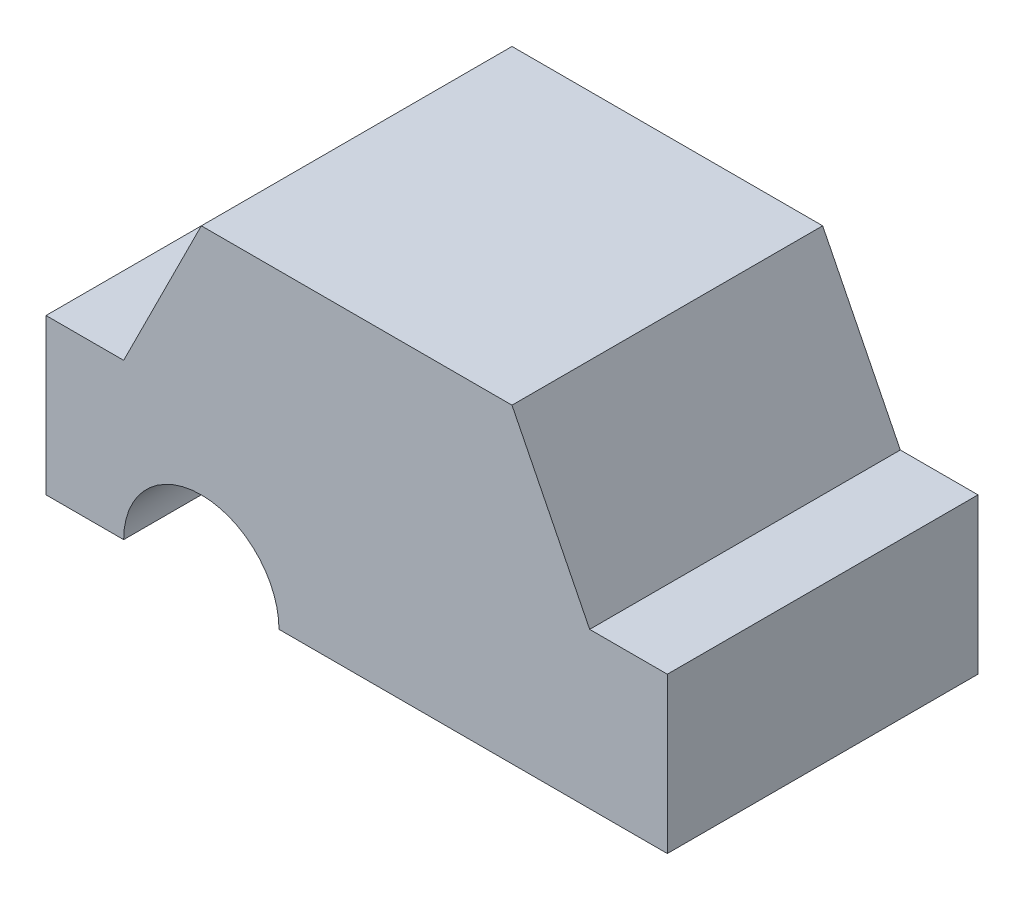
ISO-10303-21;
HEADER;
FILE_DESCRIPTION(('STEP AP214'),'2;1');
FILE_NAME('part.step','',(''),(''),'','','');
FILE_SCHEMA(('AUTOMOTIVE_DESIGN { 1 0 10303 214 1 1 1 1 }'));
ENDSEC;
DATA;
#1=APPLICATION_CONTEXT('core data for automotive mechanical design processes');
#2=APPLICATION_PROTOCOL_DEFINITION('international standard','automotive_design',2000,#1);
#3=PRODUCT_CONTEXT('',#1,'mechanical');
#4=PRODUCT('Part','Part','',(#3));
#5=PRODUCT_RELATED_PRODUCT_CATEGORY('part','',(#4));
#6=PRODUCT_DEFINITION_FORMATION('','',#4);
#7=PRODUCT_DEFINITION_CONTEXT('part definition',#1,'design');
#8=PRODUCT_DEFINITION('design','',#6,#7);
#9=PRODUCT_DEFINITION_SHAPE('','',#8);
#10=(LENGTH_UNIT() NAMED_UNIT(*) SI_UNIT(.MILLI.,.METRE.));
#11=(NAMED_UNIT(*) PLANE_ANGLE_UNIT() SI_UNIT($,.RADIAN.));
#12=(NAMED_UNIT(*) SI_UNIT($,.STERADIAN.) SOLID_ANGLE_UNIT());
#13=UNCERTAINTY_MEASURE_WITH_UNIT(LENGTH_MEASURE(1.E-05),#10,'distance_accuracy_value','');
#14=(GEOMETRIC_REPRESENTATION_CONTEXT(3) GLOBAL_UNCERTAINTY_ASSIGNED_CONTEXT((#13)) GLOBAL_UNIT_ASSIGNED_CONTEXT((#10,
#11,#12)) REPRESENTATION_CONTEXT('',''));
#15=CARTESIAN_POINT('',(0.,0.,0.));
#16=DIRECTION('',(0.,0.,1.));
#17=DIRECTION('',(1.,0.,0.));
#18=AXIS2_PLACEMENT_3D('',#15,#16,#17);
#19=CARTESIAN_POINT('',(-111.087162467944,18.2693015537788,101.6));
#20=DIRECTION('',(0.,-1.,0.));
#21=DIRECTION('',(0.,0.,-1.));
#22=AXIS2_PLACEMENT_3D('',#19,#20,#21);
#23=PLANE('',#22);
#24=DIRECTION('',(-1.,0.,0.));
#25=VECTOR('',#24,1.);
#26=CARTESIAN_POINT('',(-111.087162467944,18.2693015537788,0.));
#27=LINE('',#26,#25);
#28=CARTESIAN_POINT('',(-85.6871624679439,18.2693015537788,0.));
#29=VERTEX_POINT('',#28);
#30=CARTESIAN_POINT('',(-111.087162467944,18.2693015537788,0.));
#31=VERTEX_POINT('',#30);
#32=EDGE_CURVE('E154',#29,#31,#27,.T.);
#33=ORIENTED_EDGE('',*,*,#32,.T.);
#34=DIRECTION('',(0.,0.,-1.));
#35=VECTOR('',#34,1.);
#36=CARTESIAN_POINT('',(-111.087162467944,18.2693015537788,101.6));
#37=LINE('',#36,#35);
#38=CARTESIAN_POINT('',(-111.087162467944,18.2693015537788,101.6));
#39=VERTEX_POINT('',#38);
#40=EDGE_CURVE('E11',#39,#31,#37,.T.);
#41=ORIENTED_EDGE('',*,*,#40,.F.);
#42=DIRECTION('',(-1.,0.,0.));
#43=VECTOR('',#42,1.);
#44=CARTESIAN_POINT('',(-111.087162467944,18.2693015537788,101.6));
#45=LINE('',#44,#43);
#46=CARTESIAN_POINT('',(-85.6871624679439,18.2693015537788,101.6));
#47=VERTEX_POINT('',#46);
#48=EDGE_CURVE('E184',#47,#39,#45,.T.);
#49=ORIENTED_EDGE('',*,*,#48,.F.);
#50=DIRECTION('',(0.,0.,-1.));
#51=VECTOR('',#50,1.);
#52=CARTESIAN_POINT('',(-85.6871624679439,18.2693015537788,101.6));
#53=LINE('',#52,#51);
#54=EDGE_CURVE('E150',#47,#29,#53,.T.);
#55=ORIENTED_EDGE('',*,*,#54,.T.);
#56=EDGE_LOOP('',(#33,#41,#49,#55));
#57=FACE_BOUND('',#56,.T.);
#58=ADVANCED_FACE('F41',(#57),#23,.F.);
#59=CARTESIAN_POINT('',(-111.087162467944,18.2693015537788,101.6));
#60=DIRECTION('',(1.,0.,0.));
#61=DIRECTION('',(0.,0.,-1.));
#62=AXIS2_PLACEMENT_3D('',#59,#60,#61);
#63=PLANE('',#62);
#64=DIRECTION('',(0.,-1.,0.));
#65=VECTOR('',#64,1.);
#66=CARTESIAN_POINT('',(-111.087162467944,18.2693015537788,0.));
#67=LINE('',#66,#65);
#68=CARTESIAN_POINT('',(-111.087162467944,-32.5306984462211,0.));
#69=VERTEX_POINT('',#68);
#70=EDGE_CURVE('E158',#31,#69,#67,.T.);
#71=ORIENTED_EDGE('',*,*,#70,.T.);
#72=DIRECTION('',(0.,0.,-1.));
#73=VECTOR('',#72,1.);
#74=CARTESIAN_POINT('',(-111.087162467944,-32.5306984462211,101.6));
#75=LINE('',#74,#73);
#76=CARTESIAN_POINT('',(-111.087162467944,-32.5306984462211,101.6));
#77=VERTEX_POINT('',#76);
#78=EDGE_CURVE('E50',#77,#69,#75,.T.);
#79=ORIENTED_EDGE('',*,*,#78,.F.);
#80=DIRECTION('',(0.,-1.,0.));
#81=VECTOR('',#80,1.);
#82=CARTESIAN_POINT('',(-111.087162467944,18.2693015537788,101.6));
#83=LINE('',#82,#81);
#84=EDGE_CURVE('E107',#39,#77,#83,.T.);
#85=ORIENTED_EDGE('',*,*,#84,.F.);
#86=ORIENTED_EDGE('',*,*,#40,.T.);
#87=EDGE_LOOP('',(#71,#79,#85,#86));
#88=FACE_BOUND('',#87,.T.);
#89=ADVANCED_FACE('F246',(#88),#63,.F.);
#90=CARTESIAN_POINT('',(-111.087162467944,-32.5306984462211,101.6));
#91=DIRECTION('',(0.,1.,0.));
#92=DIRECTION('',(0.,0.,1.));
#93=AXIS2_PLACEMENT_3D('',#90,#91,#92);
#94=PLANE('',#93);
#95=DIRECTION('',(1.,0.,0.));
#96=VECTOR('',#95,1.);
#97=CARTESIAN_POINT('',(-111.087162467944,-32.5306984462211,0.));
#98=LINE('',#97,#96);
#99=CARTESIAN_POINT('',(-85.6871624679439,-32.5306984462211,0.));
#100=VERTEX_POINT('',#99);
#101=EDGE_CURVE('E161',#69,#100,#98,.T.);
#102=ORIENTED_EDGE('',*,*,#101,.T.);
#103=DIRECTION('',(0.,0.,-1.));
#104=VECTOR('',#103,1.);
#105=CARTESIAN_POINT('',(-85.6871624679439,-32.5306984462211,101.6));
#106=LINE('',#105,#104);
#107=CARTESIAN_POINT('',(-85.6871624679439,-32.5306984462211,101.6));
#108=VERTEX_POINT('',#107);
#109=EDGE_CURVE('E203',#108,#100,#106,.T.);
#110=ORIENTED_EDGE('',*,*,#109,.F.);
#111=DIRECTION('',(1.,0.,0.));
#112=VECTOR('',#111,1.);
#113=CARTESIAN_POINT('',(-111.087162467944,-32.5306984462211,101.6));
#114=LINE('',#113,#112);
#115=EDGE_CURVE('E213',#77,#108,#114,.T.);
#116=ORIENTED_EDGE('',*,*,#115,.F.);
#117=ORIENTED_EDGE('',*,*,#78,.T.);
#118=EDGE_LOOP('',(#102,#110,#116,#117));
#119=FACE_BOUND('',#118,.T.);
#120=ADVANCED_FACE('F211',(#119),#94,.F.);
#121=CARTESIAN_POINT('',(-60.2871624679492,-32.5306984462262,101.6));
#122=DIRECTION('',(0.,0.,-1.));
#123=DIRECTION('',(-1.,0.,0.));
#124=AXIS2_PLACEMENT_3D('',#121,#122,#123);
#125=CYLINDRICAL_SURFACE('',#124,25.400000000006);
#126=CARTESIAN_POINT('',(-60.2871624679492,-32.5306984462262,0.));
#127=DIRECTION('',(0.,0.,-1.));
#128=DIRECTION('',(-1.,0.,0.));
#129=AXIS2_PLACEMENT_3D('',#126,#127,#128);
#130=CIRCLE('',#129,25.400000000006);
#131=CARTESIAN_POINT('',(-34.8871624679431,-32.5306984462262,0.));
#132=VERTEX_POINT('',#131);
#133=EDGE_CURVE('E165',#100,#132,#130,.T.);
#134=ORIENTED_EDGE('',*,*,#133,.T.);
#135=DIRECTION('',(0.,0.,-1.));
#136=VECTOR('',#135,1.);
#137=CARTESIAN_POINT('',(-34.8871624679431,-32.5306984462262,101.6));
#138=LINE('',#137,#136);
#139=CARTESIAN_POINT('',(-34.8871624679431,-32.5306984462262,101.6));
#140=VERTEX_POINT('',#139);
#141=EDGE_CURVE('E199',#140,#132,#138,.T.);
#142=ORIENTED_EDGE('',*,*,#141,.F.);
#143=CARTESIAN_POINT('',(-60.2871624679443,-32.5306984462208,101.6));
#144=DIRECTION('',(0.,0.,-1.));
#145=DIRECTION('',(-1.,0.,0.));
#146=AXIS2_PLACEMENT_3D('',#143,#144,#145);
#147=CIRCLE('',#146,25.3999999999996);
#148=EDGE_CURVE('E230',#108,#140,#147,.T.);
#149=ORIENTED_EDGE('',*,*,#148,.F.);
#150=ORIENTED_EDGE('',*,*,#109,.T.);
#151=EDGE_LOOP('',(#134,#142,#149,#150));
#152=FACE_BOUND('',#151,.T.);
#153=ADVANCED_FACE('F220',(#152),#125,.F.);
#154=CARTESIAN_POINT('',(92.112837532073,-32.5306984462262,101.6));
#155=DIRECTION('',(0.,1.,0.));
#156=DIRECTION('',(0.,0.,1.));
#157=AXIS2_PLACEMENT_3D('',#154,#155,#156);
#158=PLANE('',#157);
#159=DIRECTION('',(1.,0.,0.));
#160=VECTOR('',#159,1.);
#161=CARTESIAN_POINT('',(92.112837532073,-32.5306984462262,0.));
#162=LINE('',#161,#160);
#163=CARTESIAN_POINT('',(92.112837532073,-32.5306984462262,0.));
#164=VERTEX_POINT('',#163);
#165=EDGE_CURVE('E169',#132,#164,#162,.T.);
#166=ORIENTED_EDGE('',*,*,#165,.T.);
#167=DIRECTION('',(0.,0.,-1.));
#168=VECTOR('',#167,1.);
#169=CARTESIAN_POINT('',(92.112837532073,-32.5306984462262,101.6));
#170=LINE('',#169,#168);
#171=CARTESIAN_POINT('',(92.112837532073,-32.5306984462262,101.6));
#172=VERTEX_POINT('',#171);
#173=EDGE_CURVE('E195',#172,#164,#170,.T.);
#174=ORIENTED_EDGE('',*,*,#173,.F.);
#175=DIRECTION('',(1.,0.,0.));
#176=VECTOR('',#175,1.);
#177=CARTESIAN_POINT('',(-34.8871624679422,-32.5306984462262,101.6));
#178=LINE('',#177,#176);
#179=EDGE_CURVE('E226',#140,#172,#178,.T.);
#180=ORIENTED_EDGE('',*,*,#179,.F.);
#181=ORIENTED_EDGE('',*,*,#141,.T.);
#182=EDGE_LOOP('',(#166,#174,#180,#181));
#183=FACE_BOUND('',#182,.T.);
#184=ADVANCED_FACE('F224',(#183),#158,.F.);
#185=CARTESIAN_POINT('',(92.112837532073,-32.5306984462262,101.6));
#186=DIRECTION('',(-1.,0.,0.));
#187=DIRECTION('',(0.,-1.,0.));
#188=AXIS2_PLACEMENT_3D('',#185,#186,#187);
#189=PLANE('',#188);
#190=DIRECTION('',(0.,1.,0.));
#191=VECTOR('',#190,1.);
#192=CARTESIAN_POINT('',(92.112837532073,-32.5306984462262,0.));
#193=LINE('',#192,#191);
#194=CARTESIAN_POINT('',(92.112837532073,18.2693015537738,0.));
#195=VERTEX_POINT('',#194);
#196=EDGE_CURVE('E172',#164,#195,#193,.T.);
#197=ORIENTED_EDGE('',*,*,#196,.T.);
#198=DIRECTION('',(0.,0.,-1.));
#199=VECTOR('',#198,1.);
#200=CARTESIAN_POINT('',(92.112837532073,18.2693015537738,101.6));
#201=LINE('',#200,#199);
#202=CARTESIAN_POINT('',(92.112837532073,18.2693015537738,101.6));
#203=VERTEX_POINT('',#202);
#204=EDGE_CURVE('E191',#203,#195,#201,.T.);
#205=ORIENTED_EDGE('',*,*,#204,.F.);
#206=DIRECTION('',(0.,1.,0.));
#207=VECTOR('',#206,1.);
#208=CARTESIAN_POINT('',(92.112837532073,-32.5306984462262,101.6));
#209=LINE('',#208,#207);
#210=EDGE_CURVE('E229',#172,#203,#209,.T.);
#211=ORIENTED_EDGE('',*,*,#210,.F.);
#212=ORIENTED_EDGE('',*,*,#173,.T.);
#213=EDGE_LOOP('',(#197,#205,#211,#212));
#214=FACE_BOUND('',#213,.T.);
#215=ADVANCED_FACE('F258',(#214),#189,.F.);
#216=CARTESIAN_POINT('',(66.7128375320759,18.2693015537738,101.6));
#217=DIRECTION('',(0.,-1.,0.));
#218=DIRECTION('',(0.,0.,-1.));
#219=AXIS2_PLACEMENT_3D('',#216,#217,#218);
#220=PLANE('',#219);
#221=DIRECTION('',(-1.,0.,0.));
#222=VECTOR('',#221,1.);
#223=CARTESIAN_POINT('',(66.7128375320759,18.2693015537738,0.));
#224=LINE('',#223,#222);
#225=CARTESIAN_POINT('',(66.7128375320759,18.2693015537738,0.));
#226=VERTEX_POINT('',#225);
#227=EDGE_CURVE('E175',#195,#226,#224,.T.);
#228=ORIENTED_EDGE('',*,*,#227,.T.);
#229=DIRECTION('',(0.,0.,-1.));
#230=VECTOR('',#229,1.);
#231=CARTESIAN_POINT('',(66.7128375320759,18.2693015537738,101.6));
#232=LINE('',#231,#230);
#233=CARTESIAN_POINT('',(66.7128375320759,18.2693015537738,101.6));
#234=VERTEX_POINT('',#233);
#235=EDGE_CURVE('E143',#234,#226,#232,.T.);
#236=ORIENTED_EDGE('',*,*,#235,.F.);
#237=DIRECTION('',(-1.,0.,0.));
#238=VECTOR('',#237,1.);
#239=CARTESIAN_POINT('',(66.7128375320759,18.2693015537738,101.6));
#240=LINE('',#239,#238);
#241=EDGE_CURVE('E132',#203,#234,#240,.T.);
#242=ORIENTED_EDGE('',*,*,#241,.F.);
#243=ORIENTED_EDGE('',*,*,#204,.T.);
#244=EDGE_LOOP('',(#228,#236,#242,#243));
#245=FACE_BOUND('',#244,.T.);
#246=ADVANCED_FACE('F261',(#245),#220,.F.);
#247=CARTESIAN_POINT('',(41.3128375320759,69.0693015537788,101.6));
#248=DIRECTION('',(-0.894427190999934,-0.447213595499922,0.));
#249=DIRECTION('',(0.447213595499922,-0.894427190999934,0.));
#250=AXIS2_PLACEMENT_3D('',#247,#248,#249);
#251=PLANE('',#250);
#252=DIRECTION('',(-0.447213595499922,0.894427190999934,0.));
#253=VECTOR('',#252,1.);
#254=CARTESIAN_POINT('',(41.3128375320759,69.0693015537788,0.));
#255=LINE('',#254,#253);
#256=CARTESIAN_POINT('',(41.3128375320759,69.0693015537788,0.));
#257=VERTEX_POINT('',#256);
#258=EDGE_CURVE('E141',#226,#257,#255,.T.);
#259=ORIENTED_EDGE('',*,*,#258,.T.);
#260=DIRECTION('',(0.,0.,-1.));
#261=VECTOR('',#260,1.);
#262=CARTESIAN_POINT('',(41.3128375320759,69.0693015537788,101.6));
#263=LINE('',#262,#261);
#264=CARTESIAN_POINT('',(41.3128375320759,69.0693015537788,101.6));
#265=VERTEX_POINT('',#264);
#266=EDGE_CURVE('E138',#265,#257,#263,.T.);
#267=ORIENTED_EDGE('',*,*,#266,.F.);
#268=DIRECTION('',(-0.447213595499922,0.894427190999934,0.));
#269=VECTOR('',#268,1.);
#270=CARTESIAN_POINT('',(41.3128375320759,69.0693015537788,101.6));
#271=LINE('',#270,#269);
#272=EDGE_CURVE('E126',#234,#265,#271,.T.);
#273=ORIENTED_EDGE('',*,*,#272,.F.);
#274=ORIENTED_EDGE('',*,*,#235,.T.);
#275=EDGE_LOOP('',(#259,#267,#273,#274));
#276=FACE_BOUND('',#275,.T.);
#277=ADVANCED_FACE('F139',(#276),#251,.F.);
#278=CARTESIAN_POINT('',(-60.2871624679439,69.0693015537788,101.6));
#279=DIRECTION('',(0.,-1.,0.));
#280=DIRECTION('',(0.,0.,-1.));
#281=AXIS2_PLACEMENT_3D('',#278,#279,#280);
#282=PLANE('',#281);
#283=DIRECTION('',(-1.,0.,0.));
#284=VECTOR('',#283,1.);
#285=CARTESIAN_POINT('',(-60.2871624679439,69.0693015537788,0.));
#286=LINE('',#285,#284);
#287=CARTESIAN_POINT('',(-60.2871624679439,69.0693015537788,0.));
#288=VERTEX_POINT('',#287);
#289=EDGE_CURVE('E93',#257,#288,#286,.T.);
#290=ORIENTED_EDGE('',*,*,#289,.T.);
#291=DIRECTION('',(0.,0.,-1.));
#292=VECTOR('',#291,1.);
#293=CARTESIAN_POINT('',(-60.2871624679439,69.0693015537788,101.6));
#294=LINE('',#293,#292);
#295=CARTESIAN_POINT('',(-60.2871624679439,69.0693015537788,101.6));
#296=VERTEX_POINT('',#295);
#297=EDGE_CURVE('E144',#296,#288,#294,.T.);
#298=ORIENTED_EDGE('',*,*,#297,.F.);
#299=DIRECTION('',(-1.,0.,0.));
#300=VECTOR('',#299,1.);
#301=CARTESIAN_POINT('',(-60.2871624679439,69.0693015537788,101.6));
#302=LINE('',#301,#300);
#303=EDGE_CURVE('E130',#265,#296,#302,.T.);
#304=ORIENTED_EDGE('',*,*,#303,.F.);
#305=ORIENTED_EDGE('',*,*,#266,.T.);
#306=EDGE_LOOP('',(#290,#298,#304,#305));
#307=FACE_BOUND('',#306,.T.);
#308=ADVANCED_FACE('F146',(#307),#282,.F.);
#309=CARTESIAN_POINT('',(-85.6871624679439,18.2693015537788,101.6));
#310=DIRECTION('',(0.894427190999916,-0.447213595499958,0.));
#311=DIRECTION('',(0.447213595499958,0.894427190999916,0.));
#312=AXIS2_PLACEMENT_3D('',#309,#310,#311);
#313=PLANE('',#312);
#314=DIRECTION('',(-0.447213595499958,-0.894427190999916,0.));
#315=VECTOR('',#314,1.);
#316=CARTESIAN_POINT('',(-85.6871624679439,18.2693015537788,0.));
#317=LINE('',#316,#315);
#318=EDGE_CURVE('E99',#288,#29,#317,.T.);
#319=ORIENTED_EDGE('',*,*,#318,.T.);
#320=ORIENTED_EDGE('',*,*,#54,.F.);
#321=DIRECTION('',(-0.447213595499958,-0.894427190999916,0.));
#322=VECTOR('',#321,1.);
#323=CARTESIAN_POINT('',(-85.6871624679439,18.2693015537788,101.6));
#324=LINE('',#323,#322);
#325=EDGE_CURVE('E58',#296,#47,#324,.T.);
#326=ORIENTED_EDGE('',*,*,#325,.F.);
#327=ORIENTED_EDGE('',*,*,#297,.T.);
#328=EDGE_LOOP('',(#319,#320,#326,#327));
#329=FACE_BOUND('',#328,.T.);
#330=ADVANCED_FACE('F270',(#329),#313,.F.);
#331=CARTESIAN_POINT('',(-60.2871624679492,-32.5306984462262,101.6));
#332=DIRECTION('',(0.,0.,-1.));
#333=DIRECTION('',(-1.,0.,0.));
#334=AXIS2_PLACEMENT_3D('',#331,#332,#333);
#335=PLANE('',#334);
#336=ORIENTED_EDGE('',*,*,#48,.T.);
#337=ORIENTED_EDGE('',*,*,#84,.T.);
#338=ORIENTED_EDGE('',*,*,#115,.T.);
#339=ORIENTED_EDGE('',*,*,#148,.T.);
#340=ORIENTED_EDGE('',*,*,#179,.T.);
#341=ORIENTED_EDGE('',*,*,#210,.T.);
#342=ORIENTED_EDGE('',*,*,#241,.T.);
#343=ORIENTED_EDGE('',*,*,#272,.T.);
#344=ORIENTED_EDGE('',*,*,#303,.T.);
#345=ORIENTED_EDGE('',*,*,#325,.T.);
#346=EDGE_LOOP('',(#336,#337,#338,#339,#340,#341,#342,#343,#344,#345));
#347=FACE_BOUND('',#346,.T.);
#348=ADVANCED_FACE('F128',(#347),#335,.F.);
#349=CARTESIAN_POINT('',(-60.2871624679492,-32.5306984462262,0.));
#350=DIRECTION('',(0.,0.,-1.));
#351=DIRECTION('',(-1.,0.,0.));
#352=AXIS2_PLACEMENT_3D('',#349,#350,#351);
#353=PLANE('',#352);
#354=ORIENTED_EDGE('',*,*,#32,.F.);
#355=ORIENTED_EDGE('',*,*,#318,.F.);
#356=ORIENTED_EDGE('',*,*,#289,.F.);
#357=ORIENTED_EDGE('',*,*,#258,.F.);
#358=ORIENTED_EDGE('',*,*,#227,.F.);
#359=ORIENTED_EDGE('',*,*,#196,.F.);
#360=ORIENTED_EDGE('',*,*,#165,.F.);
#361=ORIENTED_EDGE('',*,*,#133,.F.);
#362=ORIENTED_EDGE('',*,*,#101,.F.);
#363=ORIENTED_EDGE('',*,*,#70,.F.);
#364=EDGE_LOOP('',(#354,#355,#356,#357,#358,#359,#360,#361,#362,#363));
#365=FACE_BOUND('',#364,.T.);
#366=ADVANCED_FACE('F216',(#365),#353,.T.);
#367=CLOSED_SHELL('',(#58,#89,#120,#153,#184,#215,#246,#277,#308,#330,#348,#366));
#368=MANIFOLD_SOLID_BREP('B2',#367);
#369=ADVANCED_BREP_SHAPE_REPRESENTATION('',(#18,#368),#14);
#370=SHAPE_DEFINITION_REPRESENTATION(#9,#369);
ENDSEC;
END-ISO-10303-21;
